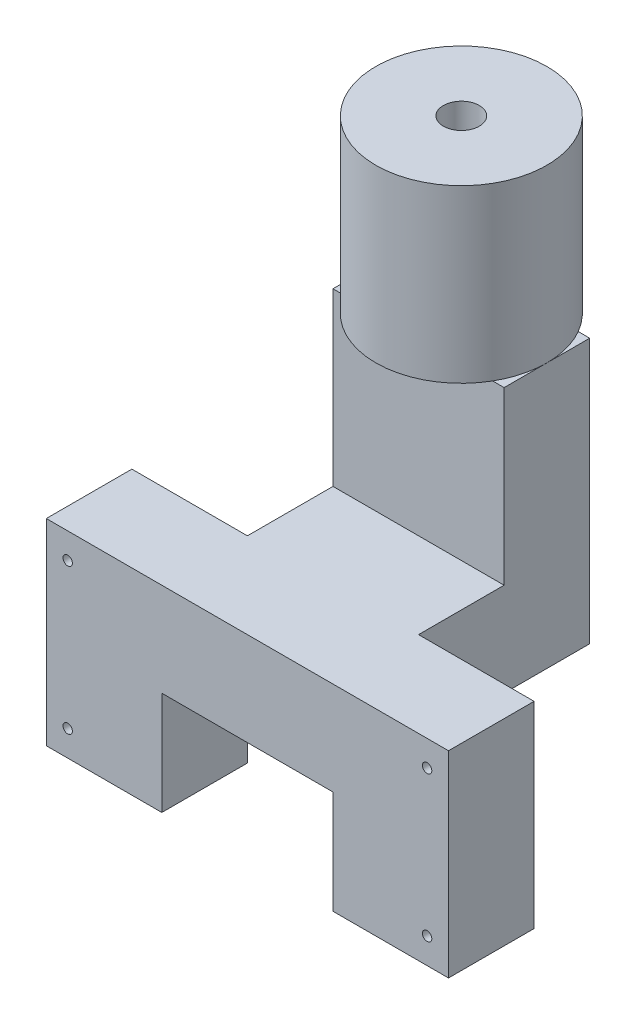
ISO-10303-21;
HEADER;
FILE_DESCRIPTION(('STEP AP214'),'2;1');
FILE_NAME('part.step','',(''),(''),'','','');
FILE_SCHEMA(('AUTOMOTIVE_DESIGN { 1 0 10303 214 1 1 1 1 }'));
ENDSEC;
DATA;
#1=APPLICATION_CONTEXT('core data for automotive mechanical design processes');
#2=APPLICATION_PROTOCOL_DEFINITION('international standard','automotive_design',2000,#1);
#3=PRODUCT_CONTEXT('',#1,'mechanical');
#4=PRODUCT('Part','Part','',(#3));
#5=PRODUCT_RELATED_PRODUCT_CATEGORY('part','',(#4));
#6=PRODUCT_DEFINITION_FORMATION('','',#4);
#7=PRODUCT_DEFINITION_CONTEXT('part definition',#1,'design');
#8=PRODUCT_DEFINITION('design','',#6,#7);
#9=PRODUCT_DEFINITION_SHAPE('','',#8);
#10=(LENGTH_UNIT() NAMED_UNIT(*) SI_UNIT(.MILLI.,.METRE.));
#11=(NAMED_UNIT(*) PLANE_ANGLE_UNIT() SI_UNIT($,.RADIAN.));
#12=(NAMED_UNIT(*) SI_UNIT($,.STERADIAN.) SOLID_ANGLE_UNIT());
#13=UNCERTAINTY_MEASURE_WITH_UNIT(LENGTH_MEASURE(1.E-05),#10,'distance_accuracy_value','');
#14=(GEOMETRIC_REPRESENTATION_CONTEXT(3) GLOBAL_UNCERTAINTY_ASSIGNED_CONTEXT((#13)) GLOBAL_UNIT_ASSIGNED_CONTEXT((#10,
#11,#12)) REPRESENTATION_CONTEXT('',''));
#15=CARTESIAN_POINT('',(0.,0.,0.));
#16=DIRECTION('',(0.,0.,1.));
#17=DIRECTION('',(1.,0.,0.));
#18=AXIS2_PLACEMENT_3D('',#15,#16,#17);
#19=CARTESIAN_POINT('',(0.,31.5,0.));
#20=DIRECTION('',(0.,1.,0.));
#21=DIRECTION('',(0.,0.,1.));
#22=AXIS2_PLACEMENT_3D('',#19,#20,#21);
#23=PLANE('',#22);
#24=CARTESIAN_POINT('',(0.,31.5,-15.));
#25=DIRECTION('',(0.,1.,0.));
#26=DIRECTION('',(0.,0.,1.));
#27=AXIS2_PLACEMENT_3D('',#24,#25,#26);
#28=CIRCLE('',#27,10.);
#29=CARTESIAN_POINT('',(8.66025403784439,31.5,-10.));
#30=VERTEX_POINT('',#29);
#31=CARTESIAN_POINT('',(10.,31.5,-15.));
#32=VERTEX_POINT('',#31);
#33=EDGE_CURVE('E169',#30,#32,#28,.T.);
#34=ORIENTED_EDGE('',*,*,#33,.F.);
#35=DIRECTION('',(1.,0.,0.));
#36=VECTOR('',#35,1.);
#37=CARTESIAN_POINT('',(-10.,31.5,-10.));
#38=LINE('',#37,#36);
#39=CARTESIAN_POINT('',(10.,31.5,-10.));
#40=VERTEX_POINT('',#39);
#41=EDGE_CURVE('E181',#30,#40,#38,.T.);
#42=ORIENTED_EDGE('',*,*,#41,.T.);
#43=DIRECTION('',(0.,0.,-1.));
#44=VECTOR('',#43,1.);
#45=CARTESIAN_POINT('',(10.,31.5,-20.));
#46=LINE('',#45,#44);
#47=EDGE_CURVE('E187',#40,#32,#46,.T.);
#48=ORIENTED_EDGE('',*,*,#47,.T.);
#49=EDGE_LOOP('',(#34,#42,#48));
#50=FACE_BOUND('',#49,.T.);
#51=ADVANCED_FACE('F37',(#50),#23,.T.);
#52=CARTESIAN_POINT('',(8.66025403784439,31.5,-20.));
#53=VERTEX_POINT('',#52);
#54=EDGE_CURVE('E11',#32,#53,#28,.T.);
#55=ORIENTED_EDGE('',*,*,#54,.F.);
#56=CARTESIAN_POINT('',(10.,31.5,-20.));
#57=VERTEX_POINT('',#56);
#58=EDGE_CURVE('E185',#32,#57,#46,.T.);
#59=ORIENTED_EDGE('',*,*,#58,.T.);
#60=DIRECTION('',(-1.,0.,0.));
#61=VECTOR('',#60,1.);
#62=CARTESIAN_POINT('',(-10.,31.5,-20.));
#63=LINE('',#62,#61);
#64=EDGE_CURVE('E191',#57,#53,#63,.T.);
#65=ORIENTED_EDGE('',*,*,#64,.T.);
#66=EDGE_LOOP('',(#55,#59,#65));
#67=FACE_BOUND('',#66,.T.);
#68=ADVANCED_FACE('F346',(#67),#23,.T.);
#69=CARTESIAN_POINT('',(-8.66025403784439,31.5,-20.));
#70=VERTEX_POINT('',#69);
#71=CARTESIAN_POINT('',(-10.,31.5,-15.));
#72=VERTEX_POINT('',#71);
#73=EDGE_CURVE('E46',#70,#72,#28,.T.);
#74=ORIENTED_EDGE('',*,*,#73,.F.);
#75=CARTESIAN_POINT('',(-10.,31.5,-20.));
#76=VERTEX_POINT('',#75);
#77=EDGE_CURVE('E190',#70,#76,#63,.T.);
#78=ORIENTED_EDGE('',*,*,#77,.T.);
#79=DIRECTION('',(0.,0.,1.));
#80=VECTOR('',#79,1.);
#81=CARTESIAN_POINT('',(-10.,31.5,-20.));
#82=LINE('',#81,#80);
#83=EDGE_CURVE('E179',#76,#72,#82,.T.);
#84=ORIENTED_EDGE('',*,*,#83,.T.);
#85=EDGE_LOOP('',(#74,#78,#84));
#86=FACE_BOUND('',#85,.T.);
#87=ADVANCED_FACE('F316',(#86),#23,.T.);
#88=CARTESIAN_POINT('',(-23.5,11.5,10.));
#89=DIRECTION('',(0.,-1.,0.));
#90=DIRECTION('',(0.,0.,-1.));
#91=AXIS2_PLACEMENT_3D('',#88,#89,#90);
#92=PLANE('',#91);
#93=DIRECTION('',(1.,0.,0.));
#94=VECTOR('',#93,1.);
#95=CARTESIAN_POINT('',(-10.,11.5,-10.));
#96=LINE('',#95,#94);
#97=CARTESIAN_POINT('',(-10.,11.5,-10.));
#98=VERTEX_POINT('',#97);
#99=CARTESIAN_POINT('',(10.,11.5,-10.));
#100=VERTEX_POINT('',#99);
#101=EDGE_CURVE('E175',#98,#100,#96,.T.);
#102=ORIENTED_EDGE('',*,*,#101,.F.);
#103=DIRECTION('',(0.,0.,1.));
#104=VECTOR('',#103,1.);
#105=CARTESIAN_POINT('',(-10.,11.5,-20.));
#106=LINE('',#105,#104);
#107=CARTESIAN_POINT('',(-10.,11.5,0.));
#108=VERTEX_POINT('',#107);
#109=EDGE_CURVE('E217',#98,#108,#106,.T.);
#110=ORIENTED_EDGE('',*,*,#109,.T.);
#111=DIRECTION('',(-1.,0.,0.));
#112=VECTOR('',#111,1.);
#113=CARTESIAN_POINT('',(-23.5,11.5,0.));
#114=LINE('',#113,#112);
#115=CARTESIAN_POINT('',(-23.5,11.5,0.));
#116=VERTEX_POINT('',#115);
#117=EDGE_CURVE('E285',#108,#116,#114,.T.);
#118=ORIENTED_EDGE('',*,*,#117,.T.);
#119=DIRECTION('',(0.,0.,-1.));
#120=VECTOR('',#119,1.);
#121=CARTESIAN_POINT('',(-23.5,11.5,10.));
#122=LINE('',#121,#120);
#123=CARTESIAN_POINT('',(-23.5,11.5,10.));
#124=VERTEX_POINT('',#123);
#125=EDGE_CURVE('E299',#124,#116,#122,.T.);
#126=ORIENTED_EDGE('',*,*,#125,.F.);
#127=DIRECTION('',(-1.,0.,0.));
#128=VECTOR('',#127,1.);
#129=CARTESIAN_POINT('',(-23.5,11.5,10.));
#130=LINE('',#129,#128);
#131=CARTESIAN_POINT('',(23.5,11.5,10.));
#132=VERTEX_POINT('',#131);
#133=EDGE_CURVE('E273',#132,#124,#130,.T.);
#134=ORIENTED_EDGE('',*,*,#133,.F.);
#135=DIRECTION('',(0.,0.,-1.));
#136=VECTOR('',#135,1.);
#137=CARTESIAN_POINT('',(23.5,11.5,10.));
#138=LINE('',#137,#136);
#139=CARTESIAN_POINT('',(23.5,11.5,0.));
#140=VERTEX_POINT('',#139);
#141=EDGE_CURVE('E301',#132,#140,#138,.T.);
#142=ORIENTED_EDGE('',*,*,#141,.T.);
#143=CARTESIAN_POINT('',(10.,11.5,0.));
#144=VERTEX_POINT('',#143);
#145=EDGE_CURVE('E286',#140,#144,#114,.T.);
#146=ORIENTED_EDGE('',*,*,#145,.T.);
#147=DIRECTION('',(0.,0.,1.));
#148=VECTOR('',#147,1.);
#149=CARTESIAN_POINT('',(10.,11.5,-20.));
#150=LINE('',#149,#148);
#151=EDGE_CURVE('E211',#100,#144,#150,.T.);
#152=ORIENTED_EDGE('',*,*,#151,.F.);
#153=EDGE_LOOP('',(#102,#110,#118,#126,#134,#142,#146,#152));
#154=FACE_BOUND('',#153,.T.);
#155=ADVANCED_FACE('F356',(#154),#92,.F.);
#156=CARTESIAN_POINT('',(0.,0.,0.));
#157=DIRECTION('',(0.,0.,1.));
#158=DIRECTION('',(1.,0.,0.));
#159=AXIS2_PLACEMENT_3D('',#156,#157,#158);
#160=PLANE('',#159);
#161=CARTESIAN_POINT('',(21.,8.5,0.));
#162=DIRECTION('',(0.,0.,1.));
#163=DIRECTION('',(1.,0.,0.));
#164=AXIS2_PLACEMENT_3D('',#161,#162,#163);
#165=CIRCLE('',#164,0.549999999999988);
#166=CARTESIAN_POINT('',(21.55,8.5,0.));
#167=VERTEX_POINT('',#166);
#168=EDGE_CURVE('E266',#167,#167,#165,.T.);
#169=ORIENTED_EDGE('',*,*,#168,.T.);
#170=EDGE_LOOP('',(#169));
#171=FACE_BOUND('',#170,.T.);
#172=CARTESIAN_POINT('',(21.,-8.5,0.));
#173=DIRECTION('',(0.,0.,1.));
#174=DIRECTION('',(1.,0.,0.));
#175=AXIS2_PLACEMENT_3D('',#172,#173,#174);
#176=CIRCLE('',#175,0.549999999999988);
#177=CARTESIAN_POINT('',(21.55,-8.5,0.));
#178=VERTEX_POINT('',#177);
#179=EDGE_CURVE('E260',#178,#178,#176,.T.);
#180=ORIENTED_EDGE('',*,*,#179,.T.);
#181=EDGE_LOOP('',(#180));
#182=FACE_BOUND('',#181,.T.);
#183=DIRECTION('',(0.,-1.,0.));
#184=VECTOR('',#183,1.);
#185=CARTESIAN_POINT('',(10.,0.5725800859553,0.));
#186=LINE('',#185,#184);
#187=CARTESIAN_POINT('',(10.,0.5725800859553,0.));
#188=VERTEX_POINT('',#187);
#189=EDGE_CURVE('E201',#144,#188,#186,.T.);
#190=ORIENTED_EDGE('',*,*,#189,.F.);
#191=ORIENTED_EDGE('',*,*,#145,.F.);
#192=DIRECTION('',(0.,1.,0.));
#193=VECTOR('',#192,1.);
#194=CARTESIAN_POINT('',(23.5,11.5,0.));
#195=LINE('',#194,#193);
#196=CARTESIAN_POINT('',(23.5,-11.5,0.));
#197=VERTEX_POINT('',#196);
#198=EDGE_CURVE('E269',#197,#140,#195,.T.);
#199=ORIENTED_EDGE('',*,*,#198,.F.);
#200=DIRECTION('',(1.,0.,0.));
#201=VECTOR('',#200,1.);
#202=CARTESIAN_POINT('',(-23.5,-11.5,0.));
#203=LINE('',#202,#201);
#204=CARTESIAN_POINT('',(10.,-11.5,0.));
#205=VERTEX_POINT('',#204);
#206=EDGE_CURVE('E291',#205,#197,#203,.T.);
#207=ORIENTED_EDGE('',*,*,#206,.F.);
#208=DIRECTION('',(0.,-1.,0.));
#209=VECTOR('',#208,1.);
#210=CARTESIAN_POINT('',(10.,0.5725800859553,0.));
#211=LINE('',#210,#209);
#212=EDGE_CURVE('E226',#188,#205,#211,.T.);
#213=ORIENTED_EDGE('',*,*,#212,.F.);
#214=EDGE_LOOP('',(#190,#191,#199,#207,#213));
#215=FACE_BOUND('',#214,.T.);
#216=ADVANCED_FACE('F374',(#171,#182,#215),#160,.F.);
#217=CARTESIAN_POINT('',(-21.,-8.5,0.));
#218=DIRECTION('',(0.,0.,1.));
#219=DIRECTION('',(1.,0.,0.));
#220=AXIS2_PLACEMENT_3D('',#217,#218,#219);
#221=CIRCLE('',#220,0.549999999999985);
#222=CARTESIAN_POINT('',(-20.45,-8.5,0.));
#223=VERTEX_POINT('',#222);
#224=EDGE_CURVE('E254',#223,#223,#221,.T.);
#225=ORIENTED_EDGE('',*,*,#224,.T.);
#226=EDGE_LOOP('',(#225));
#227=FACE_BOUND('',#226,.T.);
#228=CARTESIAN_POINT('',(-21.,8.5,0.));
#229=DIRECTION('',(0.,0.,1.));
#230=DIRECTION('',(1.,0.,0.));
#231=AXIS2_PLACEMENT_3D('',#228,#229,#230);
#232=CIRCLE('',#231,0.549999999999988);
#233=CARTESIAN_POINT('',(-20.45,8.5,0.));
#234=VERTEX_POINT('',#233);
#235=EDGE_CURVE('E248',#234,#234,#232,.T.);
#236=ORIENTED_EDGE('',*,*,#235,.T.);
#237=EDGE_LOOP('',(#236));
#238=FACE_BOUND('',#237,.T.);
#239=DIRECTION('',(0.,1.,0.));
#240=VECTOR('',#239,1.);
#241=CARTESIAN_POINT('',(-10.,0.5725800859553,0.));
#242=LINE('',#241,#240);
#243=CARTESIAN_POINT('',(-10.,0.5725800859553,0.));
#244=VERTEX_POINT('',#243);
#245=EDGE_CURVE('E206',#244,#108,#242,.T.);
#246=ORIENTED_EDGE('',*,*,#245,.F.);
#247=DIRECTION('',(0.,-1.,0.));
#248=VECTOR('',#247,1.);
#249=CARTESIAN_POINT('',(-10.,0.,0.));
#250=LINE('',#249,#248);
#251=CARTESIAN_POINT('',(-9.99999999999999,-11.5,0.));
#252=VERTEX_POINT('',#251);
#253=EDGE_CURVE('E41',#244,#252,#250,.T.);
#254=ORIENTED_EDGE('',*,*,#253,.T.);
#255=CARTESIAN_POINT('',(-23.5,-11.5,0.));
#256=VERTEX_POINT('',#255);
#257=EDGE_CURVE('E274',#256,#252,#203,.T.);
#258=ORIENTED_EDGE('',*,*,#257,.F.);
#259=DIRECTION('',(0.,-1.,0.));
#260=VECTOR('',#259,1.);
#261=CARTESIAN_POINT('',(-23.5,11.5,0.));
#262=LINE('',#261,#260);
#263=EDGE_CURVE('E289',#116,#256,#262,.T.);
#264=ORIENTED_EDGE('',*,*,#263,.F.);
#265=ORIENTED_EDGE('',*,*,#117,.F.);
#266=EDGE_LOOP('',(#246,#254,#258,#264,#265));
#267=FACE_BOUND('',#266,.T.);
#268=ADVANCED_FACE('F353',(#227,#238,#267),#160,.F.);
#269=CARTESIAN_POINT('',(-23.5,-11.5,10.));
#270=DIRECTION('',(0.,1.,0.));
#271=DIRECTION('',(0.,0.,1.));
#272=AXIS2_PLACEMENT_3D('',#269,#270,#271);
#273=PLANE('',#272);
#274=DIRECTION('',(1.,0.,0.));
#275=VECTOR('',#274,1.);
#276=CARTESIAN_POINT('',(-23.5,-11.5,10.));
#277=LINE('',#276,#275);
#278=CARTESIAN_POINT('',(10.,-11.5,10.));
#279=VERTEX_POINT('',#278);
#280=CARTESIAN_POINT('',(23.5,-11.5,10.));
#281=VERTEX_POINT('',#280);
#282=EDGE_CURVE('E278',#279,#281,#277,.T.);
#283=ORIENTED_EDGE('',*,*,#282,.F.);
#284=DIRECTION('',(0.,0.,-1.));
#285=VECTOR('',#284,1.);
#286=CARTESIAN_POINT('',(10.,-11.5,10.));
#287=LINE('',#286,#285);
#288=EDGE_CURVE('E242',#279,#205,#287,.T.);
#289=ORIENTED_EDGE('',*,*,#288,.T.);
#290=ORIENTED_EDGE('',*,*,#206,.T.);
#291=DIRECTION('',(0.,0.,-1.));
#292=VECTOR('',#291,1.);
#293=CARTESIAN_POINT('',(23.5,-11.5,10.));
#294=LINE('',#293,#292);
#295=EDGE_CURVE('E282',#281,#197,#294,.T.);
#296=ORIENTED_EDGE('',*,*,#295,.F.);
#297=EDGE_LOOP('',(#283,#289,#290,#296));
#298=FACE_BOUND('',#297,.T.);
#299=ADVANCED_FACE('F379',(#298),#273,.F.);
#300=CARTESIAN_POINT('',(23.5,11.5,10.));
#301=DIRECTION('',(-1.,0.,0.));
#302=DIRECTION('',(0.,-1.,0.));
#303=AXIS2_PLACEMENT_3D('',#300,#301,#302);
#304=PLANE('',#303);
#305=ORIENTED_EDGE('',*,*,#198,.T.);
#306=ORIENTED_EDGE('',*,*,#141,.F.);
#307=DIRECTION('',(0.,1.,0.));
#308=VECTOR('',#307,1.);
#309=CARTESIAN_POINT('',(23.5,11.5,10.));
#310=LINE('',#309,#308);
#311=EDGE_CURVE('E270',#281,#132,#310,.T.);
#312=ORIENTED_EDGE('',*,*,#311,.F.);
#313=ORIENTED_EDGE('',*,*,#295,.T.);
#314=EDGE_LOOP('',(#305,#306,#312,#313));
#315=FACE_BOUND('',#314,.T.);
#316=ADVANCED_FACE('F39',(#315),#304,.F.);
#317=CARTESIAN_POINT('',(-23.5,11.5,10.));
#318=DIRECTION('',(1.,0.,0.));
#319=DIRECTION('',(0.,1.,0.));
#320=AXIS2_PLACEMENT_3D('',#317,#318,#319);
#321=PLANE('',#320);
#322=ORIENTED_EDGE('',*,*,#263,.T.);
#323=DIRECTION('',(0.,0.,-1.));
#324=VECTOR('',#323,1.);
#325=CARTESIAN_POINT('',(-23.5,-11.5,10.));
#326=LINE('',#325,#324);
#327=CARTESIAN_POINT('',(-23.5,-11.5,10.));
#328=VERTEX_POINT('',#327);
#329=EDGE_CURVE('E296',#328,#256,#326,.T.);
#330=ORIENTED_EDGE('',*,*,#329,.F.);
#331=DIRECTION('',(0.,-1.,0.));
#332=VECTOR('',#331,1.);
#333=CARTESIAN_POINT('',(-23.5,11.5,10.));
#334=LINE('',#333,#332);
#335=EDGE_CURVE('E276',#124,#328,#334,.T.);
#336=ORIENTED_EDGE('',*,*,#335,.F.);
#337=ORIENTED_EDGE('',*,*,#125,.T.);
#338=EDGE_LOOP('',(#322,#330,#336,#337));
#339=FACE_BOUND('',#338,.T.);
#340=ADVANCED_FACE('F359',(#339),#321,.F.);
#341=ORIENTED_EDGE('',*,*,#257,.T.);
#342=DIRECTION('',(0.,0.,1.));
#343=VECTOR('',#342,1.);
#344=CARTESIAN_POINT('',(-9.99999999999999,-11.5,10.));
#345=LINE('',#344,#343);
#346=CARTESIAN_POINT('',(-9.99999999999999,-11.5,10.));
#347=VERTEX_POINT('',#346);
#348=EDGE_CURVE('E228',#252,#347,#345,.T.);
#349=ORIENTED_EDGE('',*,*,#348,.T.);
#350=EDGE_CURVE('E279',#328,#347,#277,.T.);
#351=ORIENTED_EDGE('',*,*,#350,.F.);
#352=ORIENTED_EDGE('',*,*,#329,.T.);
#353=EDGE_LOOP('',(#341,#349,#351,#352));
#354=FACE_BOUND('',#353,.T.);
#355=ADVANCED_FACE('F382',(#354),#273,.F.);
#356=CARTESIAN_POINT('',(0.,0.,10.));
#357=DIRECTION('',(0.,0.,1.));
#358=DIRECTION('',(1.,0.,0.));
#359=AXIS2_PLACEMENT_3D('',#356,#357,#358);
#360=PLANE('',#359);
#361=DIRECTION('',(0.,1.,0.));
#362=VECTOR('',#361,1.);
#363=CARTESIAN_POINT('',(10.,0.5725800859553,10.));
#364=LINE('',#363,#362);
#365=CARTESIAN_POINT('',(10.,0.5725800859553,10.));
#366=VERTEX_POINT('',#365);
#367=EDGE_CURVE('E225',#279,#366,#364,.T.);
#368=ORIENTED_EDGE('',*,*,#367,.F.);
#369=ORIENTED_EDGE('',*,*,#282,.T.);
#370=ORIENTED_EDGE('',*,*,#311,.T.);
#371=ORIENTED_EDGE('',*,*,#133,.T.);
#372=ORIENTED_EDGE('',*,*,#335,.T.);
#373=ORIENTED_EDGE('',*,*,#350,.T.);
#374=DIRECTION('',(0.,-1.,0.));
#375=VECTOR('',#374,1.);
#376=CARTESIAN_POINT('',(-10.,0.5725800859553,10.));
#377=LINE('',#376,#375);
#378=CARTESIAN_POINT('',(-10.,0.5725800859553,10.));
#379=VERTEX_POINT('',#378);
#380=EDGE_CURVE('E234',#379,#347,#377,.T.);
#381=ORIENTED_EDGE('',*,*,#380,.F.);
#382=DIRECTION('',(-1.,0.,0.));
#383=VECTOR('',#382,1.);
#384=CARTESIAN_POINT('',(-10.,0.5725800859553,10.));
#385=LINE('',#384,#383);
#386=EDGE_CURVE('E231',#366,#379,#385,.T.);
#387=ORIENTED_EDGE('',*,*,#386,.F.);
#388=EDGE_LOOP('',(#368,#369,#370,#371,#372,#373,#381,#387));
#389=FACE_BOUND('',#388,.T.);
#390=CARTESIAN_POINT('',(-21.,8.5,10.));
#391=DIRECTION('',(0.,0.,1.));
#392=DIRECTION('',(1.,0.,0.));
#393=AXIS2_PLACEMENT_3D('',#390,#391,#392);
#394=CIRCLE('',#393,0.549999999999988);
#395=CARTESIAN_POINT('',(-20.45,8.5,10.));
#396=VERTEX_POINT('',#395);
#397=EDGE_CURVE('E245',#396,#396,#394,.T.);
#398=ORIENTED_EDGE('',*,*,#397,.F.);
#399=EDGE_LOOP('',(#398));
#400=FACE_BOUND('',#399,.T.);
#401=CARTESIAN_POINT('',(-21.,-8.5,10.));
#402=DIRECTION('',(0.,0.,1.));
#403=DIRECTION('',(1.,0.,0.));
#404=AXIS2_PLACEMENT_3D('',#401,#402,#403);
#405=CIRCLE('',#404,0.549999999999988);
#406=CARTESIAN_POINT('',(-20.45,-8.5,10.));
#407=VERTEX_POINT('',#406);
#408=EDGE_CURVE('E251',#407,#407,#405,.T.);
#409=ORIENTED_EDGE('',*,*,#408,.F.);
#410=EDGE_LOOP('',(#409));
#411=FACE_BOUND('',#410,.T.);
#412=CARTESIAN_POINT('',(21.,-8.5,10.));
#413=DIRECTION('',(0.,0.,1.));
#414=DIRECTION('',(1.,0.,0.));
#415=AXIS2_PLACEMENT_3D('',#412,#413,#414);
#416=CIRCLE('',#415,0.549999999999988);
#417=CARTESIAN_POINT('',(21.55,-8.5,10.));
#418=VERTEX_POINT('',#417);
#419=EDGE_CURVE('E257',#418,#418,#416,.T.);
#420=ORIENTED_EDGE('',*,*,#419,.F.);
#421=EDGE_LOOP('',(#420));
#422=FACE_BOUND('',#421,.T.);
#423=CARTESIAN_POINT('',(21.,8.5,10.));
#424=DIRECTION('',(0.,0.,1.));
#425=DIRECTION('',(1.,0.,0.));
#426=AXIS2_PLACEMENT_3D('',#423,#424,#425);
#427=CIRCLE('',#426,0.549999999999988);
#428=CARTESIAN_POINT('',(21.55,8.5,10.));
#429=VERTEX_POINT('',#428);
#430=EDGE_CURVE('E263',#429,#429,#427,.T.);
#431=ORIENTED_EDGE('',*,*,#430,.F.);
#432=EDGE_LOOP('',(#431));
#433=FACE_BOUND('',#432,.T.);
#434=ADVANCED_FACE('F364',(#389,#400,#411,#422,#433),#360,.T.);
#435=CARTESIAN_POINT('',(21.,8.5,10.));
#436=DIRECTION('',(0.,0.,1.));
#437=DIRECTION('',(1.,0.,0.));
#438=AXIS2_PLACEMENT_3D('',#435,#436,#437);
#439=CYLINDRICAL_SURFACE('',#438,0.549999999999988);
#440=ORIENTED_EDGE('',*,*,#168,.F.);
#441=EDGE_LOOP('',(#440));
#442=FACE_BOUND('',#441,.T.);
#443=ORIENTED_EDGE('',*,*,#430,.T.);
#444=EDGE_LOOP('',(#443));
#445=FACE_BOUND('',#444,.T.);
#446=ADVANCED_FACE('F429',(#442,#445),#439,.F.);
#447=CARTESIAN_POINT('',(21.,-8.5,10.));
#448=DIRECTION('',(0.,0.,1.));
#449=DIRECTION('',(1.,0.,0.));
#450=AXIS2_PLACEMENT_3D('',#447,#448,#449);
#451=CYLINDRICAL_SURFACE('',#450,0.549999999999988);
#452=ORIENTED_EDGE('',*,*,#179,.F.);
#453=EDGE_LOOP('',(#452));
#454=FACE_BOUND('',#453,.T.);
#455=ORIENTED_EDGE('',*,*,#419,.T.);
#456=EDGE_LOOP('',(#455));
#457=FACE_BOUND('',#456,.T.);
#458=ADVANCED_FACE('F437',(#454,#457),#451,.F.);
#459=CARTESIAN_POINT('',(-21.,-8.5,10.));
#460=DIRECTION('',(0.,0.,1.));
#461=DIRECTION('',(1.,0.,0.));
#462=AXIS2_PLACEMENT_3D('',#459,#460,#461);
#463=CYLINDRICAL_SURFACE('',#462,0.549999999999986);
#464=ORIENTED_EDGE('',*,*,#224,.F.);
#465=EDGE_LOOP('',(#464));
#466=FACE_BOUND('',#465,.T.);
#467=ORIENTED_EDGE('',*,*,#408,.T.);
#468=EDGE_LOOP('',(#467));
#469=FACE_BOUND('',#468,.T.);
#470=ADVANCED_FACE('F445',(#466,#469),#463,.F.);
#471=CARTESIAN_POINT('',(-21.,8.5,10.));
#472=DIRECTION('',(0.,0.,1.));
#473=DIRECTION('',(1.,0.,0.));
#474=AXIS2_PLACEMENT_3D('',#471,#472,#473);
#475=CYLINDRICAL_SURFACE('',#474,0.549999999999988);
#476=ORIENTED_EDGE('',*,*,#235,.F.);
#477=EDGE_LOOP('',(#476));
#478=FACE_BOUND('',#477,.T.);
#479=ORIENTED_EDGE('',*,*,#397,.T.);
#480=EDGE_LOOP('',(#479));
#481=FACE_BOUND('',#480,.T.);
#482=ADVANCED_FACE('F453',(#478,#481),#475,.F.);
#483=CARTESIAN_POINT('',(10.,0.5725800859553,-25.));
#484=DIRECTION('',(1.,0.,0.));
#485=DIRECTION('',(0.,1.,0.));
#486=AXIS2_PLACEMENT_3D('',#483,#484,#485);
#487=PLANE('',#486);
#488=ORIENTED_EDGE('',*,*,#367,.T.);
#489=DIRECTION('',(0.,0.,1.));
#490=VECTOR('',#489,1.);
#491=CARTESIAN_POINT('',(10.,0.5725800859553,-25.));
#492=LINE('',#491,#490);
#493=EDGE_CURVE('E236',#188,#366,#492,.T.);
#494=ORIENTED_EDGE('',*,*,#493,.F.);
#495=ORIENTED_EDGE('',*,*,#212,.T.);
#496=ORIENTED_EDGE('',*,*,#288,.F.);
#497=EDGE_LOOP('',(#488,#494,#495,#496));
#498=FACE_BOUND('',#497,.T.);
#499=ADVANCED_FACE('F377',(#498),#487,.F.);
#500=CARTESIAN_POINT('',(-10.,0.5725800859553,-25.));
#501=DIRECTION('',(-1.,0.,0.));
#502=DIRECTION('',(0.,-1.,0.));
#503=AXIS2_PLACEMENT_3D('',#500,#501,#502);
#504=PLANE('',#503);
#505=ORIENTED_EDGE('',*,*,#253,.F.);
#506=DIRECTION('',(0.,0.,1.));
#507=VECTOR('',#506,1.);
#508=CARTESIAN_POINT('',(-10.,0.5725800859553,-25.));
#509=LINE('',#508,#507);
#510=EDGE_CURVE('E229',#244,#379,#509,.T.);
#511=ORIENTED_EDGE('',*,*,#510,.T.);
#512=ORIENTED_EDGE('',*,*,#380,.T.);
#513=ORIENTED_EDGE('',*,*,#348,.F.);
#514=EDGE_LOOP('',(#505,#511,#512,#513));
#515=FACE_BOUND('',#514,.T.);
#516=ADVANCED_FACE('F469',(#515),#504,.F.);
#517=CARTESIAN_POINT('',(-10.,0.5725800859553,-25.));
#518=DIRECTION('',(0.,1.,0.));
#519=DIRECTION('',(0.,0.,1.));
#520=AXIS2_PLACEMENT_3D('',#517,#518,#519);
#521=PLANE('',#520);
#522=ORIENTED_EDGE('',*,*,#510,.F.);
#523=DIRECTION('',(0.,0.,1.));
#524=VECTOR('',#523,1.);
#525=CARTESIAN_POINT('',(-10.,0.5725800859553,-20.));
#526=LINE('',#525,#524);
#527=CARTESIAN_POINT('',(-10.,0.5725800859553,-20.));
#528=VERTEX_POINT('',#527);
#529=EDGE_CURVE('E219',#528,#244,#526,.T.);
#530=ORIENTED_EDGE('',*,*,#529,.F.);
#531=DIRECTION('',(-1.,0.,0.));
#532=VECTOR('',#531,1.);
#533=CARTESIAN_POINT('',(10.,0.5725800859553,-20.));
#534=LINE('',#533,#532);
#535=CARTESIAN_POINT('',(10.,0.5725800859553,-20.));
#536=VERTEX_POINT('',#535);
#537=EDGE_CURVE('E205',#536,#528,#534,.T.);
#538=ORIENTED_EDGE('',*,*,#537,.F.);
#539=DIRECTION('',(0.,0.,1.));
#540=VECTOR('',#539,1.);
#541=CARTESIAN_POINT('',(10.,0.5725800859553,-20.));
#542=LINE('',#541,#540);
#543=EDGE_CURVE('E222',#536,#188,#542,.T.);
#544=ORIENTED_EDGE('',*,*,#543,.T.);
#545=ORIENTED_EDGE('',*,*,#493,.T.);
#546=ORIENTED_EDGE('',*,*,#386,.T.);
#547=EDGE_LOOP('',(#522,#530,#538,#544,#545,#546));
#548=FACE_BOUND('',#547,.T.);
#549=ADVANCED_FACE('F350',(#548),#521,.F.);
#550=CARTESIAN_POINT('',(10.,0.5725800859553,-20.));
#551=DIRECTION('',(-1.,0.,0.));
#552=DIRECTION('',(0.,0.,1.));
#553=AXIS2_PLACEMENT_3D('',#550,#551,#552);
#554=PLANE('',#553);
#555=ORIENTED_EDGE('',*,*,#189,.T.);
#556=ORIENTED_EDGE('',*,*,#543,.F.);
#557=DIRECTION('',(0.,-1.,0.));
#558=VECTOR('',#557,1.);
#559=CARTESIAN_POINT('',(10.,0.5725800859553,-20.));
#560=LINE('',#559,#558);
#561=EDGE_CURVE('E202',#57,#536,#560,.T.);
#562=ORIENTED_EDGE('',*,*,#561,.F.);
#563=ORIENTED_EDGE('',*,*,#58,.F.);
#564=ORIENTED_EDGE('',*,*,#47,.F.);
#565=DIRECTION('',(0.,-1.,0.));
#566=VECTOR('',#565,1.);
#567=CARTESIAN_POINT('',(10.,31.5,-10.));
#568=LINE('',#567,#566);
#569=EDGE_CURVE('E193',#40,#100,#568,.T.);
#570=ORIENTED_EDGE('',*,*,#569,.T.);
#571=ORIENTED_EDGE('',*,*,#151,.T.);
#572=EDGE_LOOP('',(#555,#556,#562,#563,#564,#570,#571));
#573=FACE_BOUND('',#572,.T.);
#574=ADVANCED_FACE('F342',(#573),#554,.F.);
#575=CARTESIAN_POINT('',(-10.,0.5725800859553,-20.));
#576=DIRECTION('',(1.,0.,0.));
#577=DIRECTION('',(0.,0.,-1.));
#578=AXIS2_PLACEMENT_3D('',#575,#576,#577);
#579=PLANE('',#578);
#580=ORIENTED_EDGE('',*,*,#245,.T.);
#581=ORIENTED_EDGE('',*,*,#109,.F.);
#582=DIRECTION('',(0.,-1.,0.));
#583=VECTOR('',#582,1.);
#584=CARTESIAN_POINT('',(-10.,31.5,-10.));
#585=LINE('',#584,#583);
#586=CARTESIAN_POINT('',(-10.,31.5,-10.));
#587=VERTEX_POINT('',#586);
#588=EDGE_CURVE('E198',#587,#98,#585,.T.);
#589=ORIENTED_EDGE('',*,*,#588,.F.);
#590=EDGE_CURVE('E182',#72,#587,#82,.T.);
#591=ORIENTED_EDGE('',*,*,#590,.F.);
#592=ORIENTED_EDGE('',*,*,#83,.F.);
#593=DIRECTION('',(0.,1.,0.));
#594=VECTOR('',#593,1.);
#595=CARTESIAN_POINT('',(-10.,0.5725800859553,-20.));
#596=LINE('',#595,#594);
#597=EDGE_CURVE('E208',#528,#76,#596,.T.);
#598=ORIENTED_EDGE('',*,*,#597,.F.);
#599=ORIENTED_EDGE('',*,*,#529,.T.);
#600=EDGE_LOOP('',(#580,#581,#589,#591,#592,#598,#599));
#601=FACE_BOUND('',#600,.T.);
#602=ADVANCED_FACE('F323',(#601),#579,.F.);
#603=CARTESIAN_POINT('',(0.,0.,-20.));
#604=DIRECTION('',(0.,0.,1.));
#605=DIRECTION('',(1.,0.,0.));
#606=AXIS2_PLACEMENT_3D('',#603,#604,#605);
#607=PLANE('',#606);
#608=ORIENTED_EDGE('',*,*,#561,.T.);
#609=ORIENTED_EDGE('',*,*,#537,.T.);
#610=ORIENTED_EDGE('',*,*,#597,.T.);
#611=ORIENTED_EDGE('',*,*,#77,.F.);
#612=EDGE_CURVE('E61',#53,#70,#63,.T.);
#613=ORIENTED_EDGE('',*,*,#612,.F.);
#614=ORIENTED_EDGE('',*,*,#64,.F.);
#615=EDGE_LOOP('',(#608,#609,#610,#611,#613,#614));
#616=FACE_BOUND('',#615,.T.);
#617=ADVANCED_FACE('F319',(#616),#607,.F.);
#618=CARTESIAN_POINT('',(-10.,31.5,-10.));
#619=DIRECTION('',(0.,0.,-1.));
#620=DIRECTION('',(-1.,0.,0.));
#621=AXIS2_PLACEMENT_3D('',#618,#619,#620);
#622=PLANE('',#621);
#623=ORIENTED_EDGE('',*,*,#101,.T.);
#624=ORIENTED_EDGE('',*,*,#569,.F.);
#625=ORIENTED_EDGE('',*,*,#41,.F.);
#626=CARTESIAN_POINT('',(-8.66025403784439,31.5,-10.));
#627=VERTEX_POINT('',#626);
#628=EDGE_CURVE('E186',#627,#30,#38,.T.);
#629=ORIENTED_EDGE('',*,*,#628,.F.);
#630=EDGE_CURVE('E183',#587,#627,#38,.T.);
#631=ORIENTED_EDGE('',*,*,#630,.F.);
#632=ORIENTED_EDGE('',*,*,#588,.T.);
#633=EDGE_LOOP('',(#623,#624,#625,#629,#631,#632));
#634=FACE_BOUND('',#633,.T.);
#635=ADVANCED_FACE('F331',(#634),#622,.F.);
#636=EDGE_CURVE('E178',#72,#627,#28,.T.);
#637=ORIENTED_EDGE('',*,*,#636,.F.);
#638=ORIENTED_EDGE('',*,*,#590,.T.);
#639=ORIENTED_EDGE('',*,*,#630,.T.);
#640=EDGE_LOOP('',(#637,#638,#639));
#641=FACE_BOUND('',#640,.T.);
#642=ADVANCED_FACE('F328',(#641),#23,.T.);
#643=CARTESIAN_POINT('',(0.,31.5,-15.));
#644=DIRECTION('',(0.,1.,0.));
#645=DIRECTION('',(0.,0.,1.));
#646=AXIS2_PLACEMENT_3D('',#643,#644,#645);
#647=PLANE('',#646);
#648=EDGE_CURVE('E165',#627,#30,#28,.T.);
#649=ORIENTED_EDGE('',*,*,#648,.F.);
#650=ORIENTED_EDGE('',*,*,#628,.T.);
#651=EDGE_LOOP('',(#649,#650));
#652=FACE_BOUND('',#651,.T.);
#653=ADVANCED_FACE('F337',(#652),#647,.F.);
#654=EDGE_CURVE('E48',#53,#70,#28,.T.);
#655=ORIENTED_EDGE('',*,*,#654,.F.);
#656=ORIENTED_EDGE('',*,*,#612,.T.);
#657=EDGE_LOOP('',(#655,#656));
#658=FACE_BOUND('',#657,.T.);
#659=ADVANCED_FACE('F315',(#658),#647,.F.);
#660=CARTESIAN_POINT('',(0.,51.5,-15.));
#661=DIRECTION('',(0.,-1.,0.));
#662=DIRECTION('',(0.,0.,-1.));
#663=AXIS2_PLACEMENT_3D('',#660,#661,#662);
#664=CYLINDRICAL_SURFACE('',#663,10.);
#665=CARTESIAN_POINT('',(0.,51.5,-15.));
#666=DIRECTION('',(0.,1.,0.));
#667=DIRECTION('',(0.,0.,1.));
#668=AXIS2_PLACEMENT_3D('',#665,#666,#667);
#669=CIRCLE('',#668,10.);
#670=CARTESIAN_POINT('',(0.,51.5,-5.));
#671=VERTEX_POINT('',#670);
#672=EDGE_CURVE('E173',#671,#671,#669,.T.);
#673=ORIENTED_EDGE('',*,*,#672,.F.);
#674=EDGE_LOOP('',(#673));
#675=FACE_BOUND('',#674,.T.);
#676=ORIENTED_EDGE('',*,*,#33,.T.);
#677=ORIENTED_EDGE('',*,*,#54,.T.);
#678=ORIENTED_EDGE('',*,*,#654,.T.);
#679=ORIENTED_EDGE('',*,*,#73,.T.);
#680=ORIENTED_EDGE('',*,*,#636,.T.);
#681=ORIENTED_EDGE('',*,*,#648,.T.);
#682=EDGE_LOOP('',(#676,#677,#678,#679,#680,#681));
#683=FACE_BOUND('',#682,.T.);
#684=ADVANCED_FACE('F312',(#675,#683),#664,.T.);
#685=CARTESIAN_POINT('',(0.,51.5,-15.));
#686=DIRECTION('',(0.,1.,0.));
#687=DIRECTION('',(0.,0.,1.));
#688=AXIS2_PLACEMENT_3D('',#685,#686,#687);
#689=PLANE('',#688);
#690=CARTESIAN_POINT('',(0.,51.5,-15.));
#691=DIRECTION('',(0.,1.,0.));
#692=DIRECTION('',(0.,0.,1.));
#693=AXIS2_PLACEMENT_3D('',#690,#691,#692);
#694=CIRCLE('',#693,2.09999999999999);
#695=CARTESIAN_POINT('',(0.,51.5,-12.9));
#696=VERTEX_POINT('',#695);
#697=EDGE_CURVE('E166',#696,#696,#694,.T.);
#698=ORIENTED_EDGE('',*,*,#697,.F.);
#699=EDGE_LOOP('',(#698));
#700=FACE_BOUND('',#699,.T.);
#701=ORIENTED_EDGE('',*,*,#672,.T.);
#702=EDGE_LOOP('',(#701));
#703=FACE_BOUND('',#702,.T.);
#704=ADVANCED_FACE('F159',(#700,#703),#689,.T.);
#705=CARTESIAN_POINT('',(0.,41.5,-15.));
#706=DIRECTION('',(0.,1.,0.));
#707=DIRECTION('',(0.,0.,1.));
#708=AXIS2_PLACEMENT_3D('',#705,#706,#707);
#709=CONICAL_SURFACE('',#708,2.09999999999999,1.02974425867665);
#710=CARTESIAN_POINT('',(0.,40.2381927000421,-15.));
#711=VERTEX_POINT('',#710);
#712=VERTEX_LOOP('',#711);
#713=FACE_BOUND('',#712,.T.);
#714=CARTESIAN_POINT('',(0.,41.5,-15.));
#715=DIRECTION('',(0.,1.,0.));
#716=DIRECTION('',(0.,0.,1.));
#717=AXIS2_PLACEMENT_3D('',#714,#715,#716);
#718=CIRCLE('',#717,2.09999999999999);
#719=CARTESIAN_POINT('',(0.,41.5,-12.9));
#720=VERTEX_POINT('',#719);
#721=EDGE_CURVE('E163',#720,#720,#718,.T.);
#722=ORIENTED_EDGE('',*,*,#721,.T.);
#723=EDGE_LOOP('',(#722));
#724=FACE_BOUND('',#723,.T.);
#725=ADVANCED_FACE('F155',(#713,#724),#709,.F.);
#726=CARTESIAN_POINT('',(0.,51.5,-15.));
#727=DIRECTION('',(0.,1.,0.));
#728=DIRECTION('',(0.,0.,1.));
#729=AXIS2_PLACEMENT_3D('',#726,#727,#728);
#730=CYLINDRICAL_SURFACE('',#729,2.09999999999999);
#731=ORIENTED_EDGE('',*,*,#721,.F.);
#732=EDGE_LOOP('',(#731));
#733=FACE_BOUND('',#732,.T.);
#734=ORIENTED_EDGE('',*,*,#697,.T.);
#735=EDGE_LOOP('',(#734));
#736=FACE_BOUND('',#735,.T.);
#737=ADVANCED_FACE('F158',(#733,#736),#730,.F.);
#738=CLOSED_SHELL('',(#51,#68,#87,#155,#216,#268,#299,#316,#340,#355,#434,#446,#458,#470,#482,
#499,#516,#549,#574,#602,#617,#635,#642,#653,#659,#684,#704,#725,#737));
#739=MANIFOLD_SOLID_BREP('B2',#738);
#740=ADVANCED_BREP_SHAPE_REPRESENTATION('',(#18,#739),#14);
#741=SHAPE_DEFINITION_REPRESENTATION(#9,#740);
ENDSEC;
END-ISO-10303-21;
